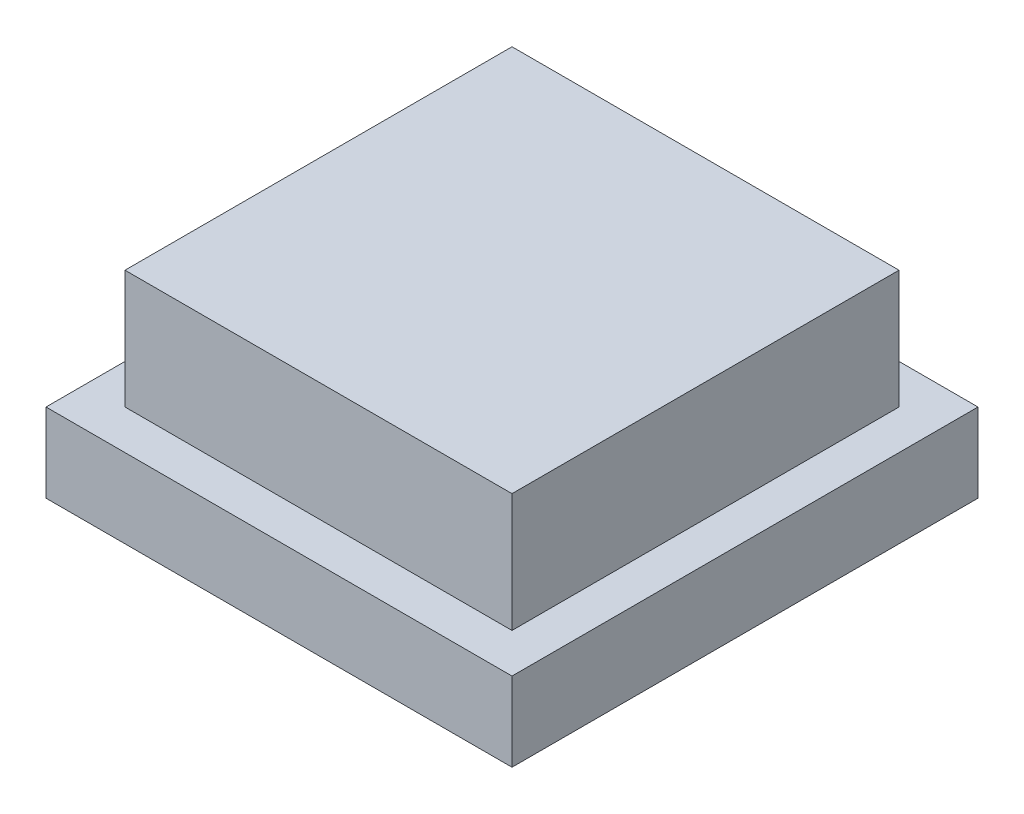
ISO-10303-21;
HEADER;
FILE_DESCRIPTION(('STEP AP214'),'2;1');
FILE_NAME('part.step','',(''),(''),'','','');
FILE_SCHEMA(('AUTOMOTIVE_DESIGN { 1 0 10303 214 1 1 1 1 }'));
ENDSEC;
DATA;
#1=APPLICATION_CONTEXT('core data for automotive mechanical design processes');
#2=APPLICATION_PROTOCOL_DEFINITION('international standard','automotive_design',2000,#1);
#3=PRODUCT_CONTEXT('',#1,'mechanical');
#4=PRODUCT('Part','Part','',(#3));
#5=PRODUCT_RELATED_PRODUCT_CATEGORY('part','',(#4));
#6=PRODUCT_DEFINITION_FORMATION('','',#4);
#7=PRODUCT_DEFINITION_CONTEXT('part definition',#1,'design');
#8=PRODUCT_DEFINITION('design','',#6,#7);
#9=PRODUCT_DEFINITION_SHAPE('','',#8);
#10=(LENGTH_UNIT() NAMED_UNIT(*) SI_UNIT(.MILLI.,.METRE.));
#11=(NAMED_UNIT(*) PLANE_ANGLE_UNIT() SI_UNIT($,.RADIAN.));
#12=(NAMED_UNIT(*) SI_UNIT($,.STERADIAN.) SOLID_ANGLE_UNIT());
#13=UNCERTAINTY_MEASURE_WITH_UNIT(LENGTH_MEASURE(1.E-05),#10,'distance_accuracy_value','');
#14=(GEOMETRIC_REPRESENTATION_CONTEXT(3) GLOBAL_UNCERTAINTY_ASSIGNED_CONTEXT((#13)) GLOBAL_UNIT_ASSIGNED_CONTEXT((#10,
#11,#12)) REPRESENTATION_CONTEXT('',''));
#15=CARTESIAN_POINT('',(0.,0.,0.));
#16=DIRECTION('',(0.,0.,1.));
#17=DIRECTION('',(1.,0.,0.));
#18=AXIS2_PLACEMENT_3D('',#15,#16,#17);
#19=CARTESIAN_POINT('',(-6.68976305895802,5.,0.));
#20=DIRECTION('',(-1.,0.,0.));
#21=DIRECTION('',(0.,0.,1.));
#22=AXIS2_PLACEMENT_3D('',#19,#20,#21);
#23=PLANE('',#22);
#24=DIRECTION('',(0.,0.,1.));
#25=VECTOR('',#24,1.);
#26=CARTESIAN_POINT('',(-6.68976305895802,2.,6.34374083177053));
#27=LINE('',#26,#25);
#28=CARTESIAN_POINT('',(-6.68976305895802,2.,-3.45625916822948));
#29=VERTEX_POINT('',#28);
#30=CARTESIAN_POINT('',(-6.68976305895802,2.,6.34374083177053));
#31=VERTEX_POINT('',#30);
#32=EDGE_CURVE('E49',#29,#31,#27,.T.);
#33=ORIENTED_EDGE('',*,*,#32,.T.);
#34=DIRECTION('',(0.,-1.,0.));
#35=VECTOR('',#34,1.);
#36=CARTESIAN_POINT('',(-6.68976305895802,5.,6.34374083177053));
#37=LINE('',#36,#35);
#38=CARTESIAN_POINT('',(-6.68976305895802,5.,6.34374083177053));
#39=VERTEX_POINT('',#38);
#40=EDGE_CURVE('E11',#39,#31,#37,.T.);
#41=ORIENTED_EDGE('',*,*,#40,.F.);
#42=DIRECTION('',(0.,0.,-1.));
#43=VECTOR('',#42,1.);
#44=CARTESIAN_POINT('',(-6.68976305895802,5.,0.));
#45=LINE('',#44,#43);
#46=CARTESIAN_POINT('',(-6.68976305895802,5.,-3.45625916822948));
#47=VERTEX_POINT('',#46);
#48=EDGE_CURVE('E116',#39,#47,#45,.T.);
#49=ORIENTED_EDGE('',*,*,#48,.T.);
#50=DIRECTION('',(0.,-1.,0.));
#51=VECTOR('',#50,1.);
#52=CARTESIAN_POINT('',(-6.68976305895802,5.,-3.45625916822948));
#53=LINE('',#52,#51);
#54=EDGE_CURVE('E108',#47,#29,#53,.T.);
#55=ORIENTED_EDGE('',*,*,#54,.T.);
#56=EDGE_LOOP('',(#33,#41,#49,#55));
#57=FACE_BOUND('',#56,.T.);
#58=ADVANCED_FACE('F35',(#57),#23,.T.);
#59=CARTESIAN_POINT('',(0.,5.,6.34374083177053));
#60=DIRECTION('',(0.,0.,1.));
#61=DIRECTION('',(1.,0.,0.));
#62=AXIS2_PLACEMENT_3D('',#59,#60,#61);
#63=PLANE('',#62);
#64=DIRECTION('',(1.,0.,0.));
#65=VECTOR('',#64,1.);
#66=CARTESIAN_POINT('',(3.11023694104198,2.,6.34374083177053));
#67=LINE('',#66,#65);
#68=CARTESIAN_POINT('',(3.11023694104198,2.,6.34374083177053));
#69=VERTEX_POINT('',#68);
#70=EDGE_CURVE('E98',#31,#69,#67,.T.);
#71=ORIENTED_EDGE('',*,*,#70,.T.);
#72=DIRECTION('',(0.,-1.,0.));
#73=VECTOR('',#72,1.);
#74=CARTESIAN_POINT('',(3.11023694104198,5.,6.34374083177053));
#75=LINE('',#74,#73);
#76=CARTESIAN_POINT('',(3.11023694104198,5.,6.34374083177053));
#77=VERTEX_POINT('',#76);
#78=EDGE_CURVE('E42',#77,#69,#75,.T.);
#79=ORIENTED_EDGE('',*,*,#78,.F.);
#80=DIRECTION('',(-1.,0.,0.));
#81=VECTOR('',#80,1.);
#82=CARTESIAN_POINT('',(0.,5.,6.34374083177053));
#83=LINE('',#82,#81);
#84=EDGE_CURVE('E113',#77,#39,#83,.T.);
#85=ORIENTED_EDGE('',*,*,#84,.T.);
#86=ORIENTED_EDGE('',*,*,#40,.T.);
#87=EDGE_LOOP('',(#71,#79,#85,#86));
#88=FACE_BOUND('',#87,.T.);
#89=ADVANCED_FACE('F111',(#88),#63,.T.);
#90=CARTESIAN_POINT('',(3.11023694104198,5.,0.));
#91=DIRECTION('',(-1.,0.,0.));
#92=DIRECTION('',(0.,0.,1.));
#93=AXIS2_PLACEMENT_3D('',#90,#91,#92);
#94=PLANE('',#93);
#95=ORIENTED_EDGE('',*,*,#78,.T.);
#96=DIRECTION('',(0.,0.,-1.));
#97=VECTOR('',#96,1.);
#98=CARTESIAN_POINT('',(3.11023694104198,2.,6.34374083177053));
#99=LINE('',#98,#97);
#100=CARTESIAN_POINT('',(3.11023694104198,2.,-3.45625916822948));
#101=VERTEX_POINT('',#100);
#102=EDGE_CURVE('E101',#69,#101,#99,.T.);
#103=ORIENTED_EDGE('',*,*,#102,.T.);
#104=DIRECTION('',(0.,-1.,0.));
#105=VECTOR('',#104,1.);
#106=CARTESIAN_POINT('',(3.11023694104198,5.,-3.45625916822948));
#107=LINE('',#106,#105);
#108=CARTESIAN_POINT('',(3.11023694104198,5.,-3.45625916822948));
#109=VERTEX_POINT('',#108);
#110=EDGE_CURVE('E125',#109,#101,#107,.T.);
#111=ORIENTED_EDGE('',*,*,#110,.F.);
#112=DIRECTION('',(0.,0.,-1.));
#113=VECTOR('',#112,1.);
#114=CARTESIAN_POINT('',(3.11023694104198,5.,0.));
#115=LINE('',#114,#113);
#116=EDGE_CURVE('E115',#77,#109,#115,.T.);
#117=ORIENTED_EDGE('',*,*,#116,.F.);
#118=EDGE_LOOP('',(#95,#103,#111,#117));
#119=FACE_BOUND('',#118,.T.);
#120=ADVANCED_FACE('F128',(#119),#94,.F.);
#121=CARTESIAN_POINT('',(0.,5.,-3.45625916822948));
#122=DIRECTION('',(0.,0.,1.));
#123=DIRECTION('',(1.,0.,0.));
#124=AXIS2_PLACEMENT_3D('',#121,#122,#123);
#125=PLANE('',#124);
#126=ORIENTED_EDGE('',*,*,#110,.T.);
#127=DIRECTION('',(-1.,0.,0.));
#128=VECTOR('',#127,1.);
#129=CARTESIAN_POINT('',(3.11023694104198,2.,-3.45625916822948));
#130=LINE('',#129,#128);
#131=EDGE_CURVE('E174',#101,#29,#130,.T.);
#132=ORIENTED_EDGE('',*,*,#131,.T.);
#133=ORIENTED_EDGE('',*,*,#54,.F.);
#134=DIRECTION('',(-1.,0.,0.));
#135=VECTOR('',#134,1.);
#136=CARTESIAN_POINT('',(0.,5.,-3.45625916822948));
#137=LINE('',#136,#135);
#138=EDGE_CURVE('E57',#109,#47,#137,.T.);
#139=ORIENTED_EDGE('',*,*,#138,.F.);
#140=EDGE_LOOP('',(#126,#132,#133,#139));
#141=FACE_BOUND('',#140,.T.);
#142=ADVANCED_FACE('F132',(#141),#125,.F.);
#143=CARTESIAN_POINT('',(0.,5.,0.));
#144=DIRECTION('',(0.,1.,0.));
#145=DIRECTION('',(0.,0.,1.));
#146=AXIS2_PLACEMENT_3D('',#143,#144,#145);
#147=PLANE('',#146);
#148=ORIENTED_EDGE('',*,*,#48,.F.);
#149=ORIENTED_EDGE('',*,*,#84,.F.);
#150=ORIENTED_EDGE('',*,*,#116,.T.);
#151=ORIENTED_EDGE('',*,*,#138,.T.);
#152=EDGE_LOOP('',(#148,#149,#150,#151));
#153=FACE_BOUND('',#152,.T.);
#154=ADVANCED_FACE('F130',(#153),#147,.T.);
#155=CARTESIAN_POINT('',(0.,2.,0.));
#156=DIRECTION('',(0.,1.,0.));
#157=DIRECTION('',(0.,0.,1.));
#158=AXIS2_PLACEMENT_3D('',#155,#156,#157);
#159=PLANE('',#158);
#160=DIRECTION('',(0.,0.,-1.));
#161=VECTOR('',#160,1.);
#162=CARTESIAN_POINT('',(4.11023694104198,2.,7.34374083177053));
#163=LINE('',#162,#161);
#164=CARTESIAN_POINT('',(4.11023694104198,2.,7.34374083177053));
#165=VERTEX_POINT('',#164);
#166=CARTESIAN_POINT('',(4.11023694104198,2.,-4.45625916822948));
#167=VERTEX_POINT('',#166);
#168=EDGE_CURVE('E185',#165,#167,#163,.T.);
#169=ORIENTED_EDGE('',*,*,#168,.T.);
#170=DIRECTION('',(-1.,0.,0.));
#171=VECTOR('',#170,1.);
#172=CARTESIAN_POINT('',(4.11023694104198,2.,-4.45625916822948));
#173=LINE('',#172,#171);
#174=CARTESIAN_POINT('',(-7.68976305895802,2.,-4.45625916822948));
#175=VERTEX_POINT('',#174);
#176=EDGE_CURVE('E196',#167,#175,#173,.T.);
#177=ORIENTED_EDGE('',*,*,#176,.T.);
#178=DIRECTION('',(0.,0.,1.));
#179=VECTOR('',#178,1.);
#180=CARTESIAN_POINT('',(-7.68976305895802,2.,7.34374083177053));
#181=LINE('',#180,#179);
#182=CARTESIAN_POINT('',(-7.68976305895802,2.,7.34374083177053));
#183=VERTEX_POINT('',#182);
#184=EDGE_CURVE('E201',#175,#183,#181,.T.);
#185=ORIENTED_EDGE('',*,*,#184,.T.);
#186=DIRECTION('',(1.,0.,0.));
#187=VECTOR('',#186,1.);
#188=CARTESIAN_POINT('',(4.11023694104198,2.,7.34374083177053));
#189=LINE('',#188,#187);
#190=EDGE_CURVE('E180',#183,#165,#189,.T.);
#191=ORIENTED_EDGE('',*,*,#190,.T.);
#192=EDGE_LOOP('',(#169,#177,#185,#191));
#193=FACE_BOUND('',#192,.T.);
#194=ORIENTED_EDGE('',*,*,#70,.F.);
#195=ORIENTED_EDGE('',*,*,#32,.F.);
#196=ORIENTED_EDGE('',*,*,#131,.F.);
#197=ORIENTED_EDGE('',*,*,#102,.F.);
#198=EDGE_LOOP('',(#194,#195,#196,#197));
#199=FACE_BOUND('',#198,.T.);
#200=ADVANCED_FACE('F99',(#193,#199),#159,.T.);
#201=CARTESIAN_POINT('',(4.11023694104198,2.,7.34374083177053));
#202=DIRECTION('',(-1.,0.,0.));
#203=DIRECTION('',(0.,0.,1.));
#204=AXIS2_PLACEMENT_3D('',#201,#202,#203);
#205=PLANE('',#204);
#206=DIRECTION('',(0.,0.,-1.));
#207=VECTOR('',#206,1.);
#208=CARTESIAN_POINT('',(4.11023694104198,0.,7.34374083177053));
#209=LINE('',#208,#207);
#210=CARTESIAN_POINT('',(4.11023694104198,0.,7.34374083177053));
#211=VERTEX_POINT('',#210);
#212=CARTESIAN_POINT('',(4.11023694104198,0.,-4.45625916822948));
#213=VERTEX_POINT('',#212);
#214=EDGE_CURVE('E166',#211,#213,#209,.T.);
#215=ORIENTED_EDGE('',*,*,#214,.T.);
#216=DIRECTION('',(0.,-1.,0.));
#217=VECTOR('',#216,1.);
#218=CARTESIAN_POINT('',(4.11023694104198,2.,-4.45625916822948));
#219=LINE('',#218,#217);
#220=EDGE_CURVE('E119',#167,#213,#219,.T.);
#221=ORIENTED_EDGE('',*,*,#220,.F.);
#222=ORIENTED_EDGE('',*,*,#168,.F.);
#223=DIRECTION('',(0.,-1.,0.));
#224=VECTOR('',#223,1.);
#225=CARTESIAN_POINT('',(4.11023694104198,2.,7.34374083177053));
#226=LINE('',#225,#224);
#227=EDGE_CURVE('E186',#165,#211,#226,.T.);
#228=ORIENTED_EDGE('',*,*,#227,.T.);
#229=EDGE_LOOP('',(#215,#221,#222,#228));
#230=FACE_BOUND('',#229,.T.);
#231=ADVANCED_FACE('F138',(#230),#205,.F.);
#232=CARTESIAN_POINT('',(4.11023694104198,2.,-4.45625916822948));
#233=DIRECTION('',(0.,0.,1.));
#234=DIRECTION('',(1.,0.,0.));
#235=AXIS2_PLACEMENT_3D('',#232,#233,#234);
#236=PLANE('',#235);
#237=DIRECTION('',(-1.,0.,0.));
#238=VECTOR('',#237,1.);
#239=CARTESIAN_POINT('',(4.11023694104198,0.,-4.45625916822948));
#240=LINE('',#239,#238);
#241=CARTESIAN_POINT('',(-7.68976305895802,0.,-4.45625916822948));
#242=VERTEX_POINT('',#241);
#243=EDGE_CURVE('E169',#213,#242,#240,.T.);
#244=ORIENTED_EDGE('',*,*,#243,.T.);
#245=DIRECTION('',(0.,-1.,0.));
#246=VECTOR('',#245,1.);
#247=CARTESIAN_POINT('',(-7.68976305895802,2.,-4.45625916822948));
#248=LINE('',#247,#246);
#249=EDGE_CURVE('E191',#175,#242,#248,.T.);
#250=ORIENTED_EDGE('',*,*,#249,.F.);
#251=ORIENTED_EDGE('',*,*,#176,.F.);
#252=ORIENTED_EDGE('',*,*,#220,.T.);
#253=EDGE_LOOP('',(#244,#250,#251,#252));
#254=FACE_BOUND('',#253,.T.);
#255=ADVANCED_FACE('F194',(#254),#236,.F.);
#256=CARTESIAN_POINT('',(-7.68976305895802,2.,7.34374083177053));
#257=DIRECTION('',(1.,0.,0.));
#258=DIRECTION('',(0.,0.,-1.));
#259=AXIS2_PLACEMENT_3D('',#256,#257,#258);
#260=PLANE('',#259);
#261=DIRECTION('',(0.,0.,1.));
#262=VECTOR('',#261,1.);
#263=CARTESIAN_POINT('',(-7.68976305895802,0.,7.34374083177053));
#264=LINE('',#263,#262);
#265=CARTESIAN_POINT('',(-7.68976305895802,0.,7.34374083177053));
#266=VERTEX_POINT('',#265);
#267=EDGE_CURVE('E176',#242,#266,#264,.T.);
#268=ORIENTED_EDGE('',*,*,#267,.T.);
#269=DIRECTION('',(0.,-1.,0.));
#270=VECTOR('',#269,1.);
#271=CARTESIAN_POINT('',(-7.68976305895802,2.,7.34374083177053));
#272=LINE('',#271,#270);
#273=EDGE_CURVE('E188',#183,#266,#272,.T.);
#274=ORIENTED_EDGE('',*,*,#273,.F.);
#275=ORIENTED_EDGE('',*,*,#184,.F.);
#276=ORIENTED_EDGE('',*,*,#249,.T.);
#277=EDGE_LOOP('',(#268,#274,#275,#276));
#278=FACE_BOUND('',#277,.T.);
#279=ADVANCED_FACE('F160',(#278),#260,.F.);
#280=CARTESIAN_POINT('',(4.11023694104198,2.,7.34374083177053));
#281=DIRECTION('',(0.,0.,-1.));
#282=DIRECTION('',(-1.,0.,0.));
#283=AXIS2_PLACEMENT_3D('',#280,#281,#282);
#284=PLANE('',#283);
#285=DIRECTION('',(1.,0.,0.));
#286=VECTOR('',#285,1.);
#287=CARTESIAN_POINT('',(4.11023694104198,0.,7.34374083177053));
#288=LINE('',#287,#286);
#289=EDGE_CURVE('E168',#266,#211,#288,.T.);
#290=ORIENTED_EDGE('',*,*,#289,.T.);
#291=ORIENTED_EDGE('',*,*,#227,.F.);
#292=ORIENTED_EDGE('',*,*,#190,.F.);
#293=ORIENTED_EDGE('',*,*,#273,.T.);
#294=EDGE_LOOP('',(#290,#291,#292,#293));
#295=FACE_BOUND('',#294,.T.);
#296=ADVANCED_FACE('F155',(#295),#284,.F.);
#297=CARTESIAN_POINT('',(0.,0.,0.));
#298=DIRECTION('',(0.,1.,0.));
#299=DIRECTION('',(0.,0.,1.));
#300=AXIS2_PLACEMENT_3D('',#297,#298,#299);
#301=PLANE('',#300);
#302=ORIENTED_EDGE('',*,*,#214,.F.);
#303=ORIENTED_EDGE('',*,*,#289,.F.);
#304=ORIENTED_EDGE('',*,*,#267,.F.);
#305=ORIENTED_EDGE('',*,*,#243,.F.);
#306=EDGE_LOOP('',(#302,#303,#304,#305));
#307=FACE_BOUND('',#306,.T.);
#308=ADVANCED_FACE('F153',(#307),#301,.F.);
#309=CLOSED_SHELL('',(#58,#89,#120,#142,#154,#200,#231,#255,#279,#296,#308));
#310=MANIFOLD_SOLID_BREP('B2',#309);
#311=ADVANCED_BREP_SHAPE_REPRESENTATION('',(#18,#310),#14);
#312=SHAPE_DEFINITION_REPRESENTATION(#9,#311);
ENDSEC;
END-ISO-10303-21;
